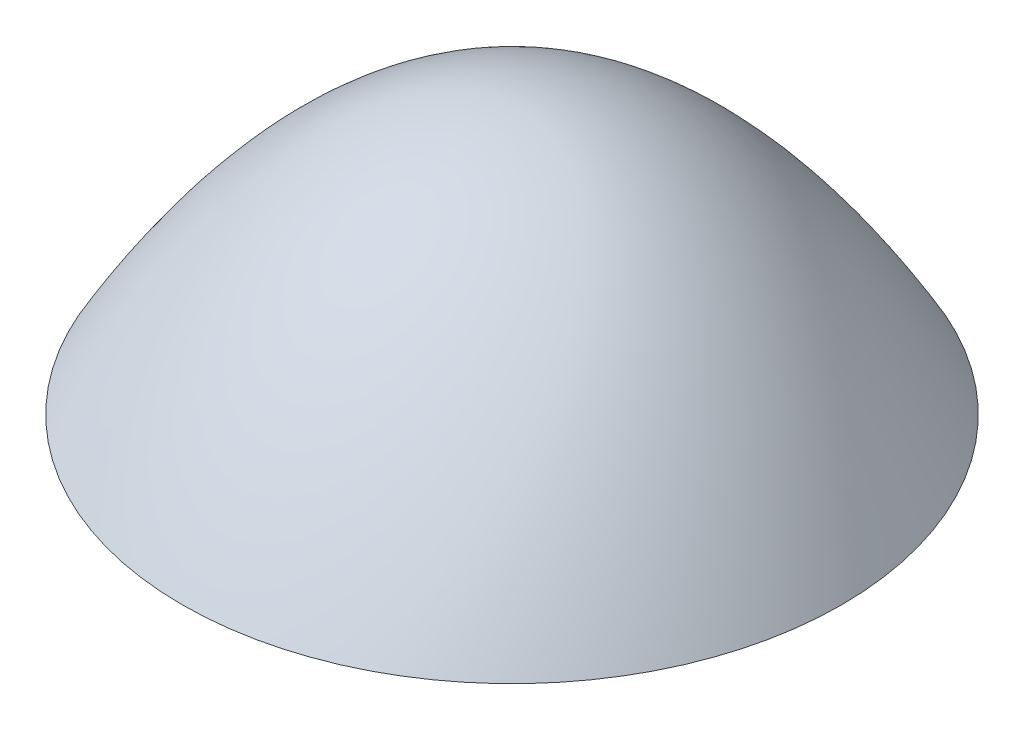
ISO-10303-21;
HEADER;
FILE_DESCRIPTION(('STEP AP214'),'2;1');
FILE_NAME('part.step','',(''),(''),'','','');
FILE_SCHEMA(('AUTOMOTIVE_DESIGN { 1 0 10303 214 1 1 1 1 }'));
ENDSEC;
DATA;
#1=APPLICATION_CONTEXT('core data for automotive mechanical design processes');
#2=APPLICATION_PROTOCOL_DEFINITION('international standard','automotive_design',2000,#1);
#3=PRODUCT_CONTEXT('',#1,'mechanical');
#4=PRODUCT('Part','Part','',(#3));
#5=PRODUCT_RELATED_PRODUCT_CATEGORY('part','',(#4));
#6=PRODUCT_DEFINITION_FORMATION('','',#4);
#7=PRODUCT_DEFINITION_CONTEXT('part definition',#1,'design');
#8=PRODUCT_DEFINITION('design','',#6,#7);
#9=PRODUCT_DEFINITION_SHAPE('','',#8);
#10=(LENGTH_UNIT() NAMED_UNIT(*) SI_UNIT(.MILLI.,.METRE.));
#11=(NAMED_UNIT(*) PLANE_ANGLE_UNIT() SI_UNIT($,.RADIAN.));
#12=(NAMED_UNIT(*) SI_UNIT($,.STERADIAN.) SOLID_ANGLE_UNIT());
#13=UNCERTAINTY_MEASURE_WITH_UNIT(LENGTH_MEASURE(1.E-05),#10,'distance_accuracy_value','');
#14=(GEOMETRIC_REPRESENTATION_CONTEXT(3) GLOBAL_UNCERTAINTY_ASSIGNED_CONTEXT((#13)) GLOBAL_UNIT_ASSIGNED_CONTEXT((#10,
#11,#12)) REPRESENTATION_CONTEXT('',''));
#15=CARTESIAN_POINT('',(0.,0.,0.));
#16=DIRECTION('',(0.,0.,1.));
#17=DIRECTION('',(1.,0.,0.));
#18=AXIS2_PLACEMENT_3D('',#15,#16,#17);
#19=CARTESIAN_POINT('',(0.,150.,0.));
#20=DIRECTION('',(0.,0.,-1.));
#21=DIRECTION('',(0.,1.,0.));
#22=AXIS2_PLACEMENT_3D('',#19,#20,#21);
#23=ELLIPSE('',#22,248.04,76.2);
#24=TRIMMED_CURVE('',#23,(PARAMETER_VALUE(0.)),(PARAMETER_VALUE(3.14159265358979)),.T.,.PARAMETER.);
#25=CARTESIAN_POINT('',(0.,0.,0.));
#26=DIRECTION('',(0.,-1.,0.));
#27=AXIS1_PLACEMENT('',#25,#26);
#28=SURFACE_OF_REVOLUTION('',#24,#27);
#29=CARTESIAN_POINT('',(0.,398.04,0.));
#30=VERTEX_POINT('',#29);
#31=VERTEX_LOOP('',#30);
#32=FACE_BOUND('',#31,.T.);
#33=CARTESIAN_POINT('',(0.,370.,0.));
#34=DIRECTION('',(0.,-1.,0.));
#35=DIRECTION('',(0.,0.,-1.));
#36=AXIS2_PLACEMENT_3D('',#33,#34,#35);
#37=CIRCLE('',#36,35.1936036452897);
#38=CARTESIAN_POINT('',(0.,370.,-35.1936036452897));
#39=VERTEX_POINT('',#38);
#40=EDGE_CURVE('E40',#39,#39,#37,.T.);
#41=ORIENTED_EDGE('',*,*,#40,.T.);
#42=EDGE_LOOP('',(#41));
#43=FACE_BOUND('',#42,.T.);
#44=ADVANCED_FACE('F35',(#32,#43),#28,.F.);
#45=CARTESIAN_POINT('',(0.,370.,0.));
#46=DIRECTION('',(0.,-1.,0.));
#47=DIRECTION('',(0.,0.,-1.));
#48=AXIS2_PLACEMENT_3D('',#45,#46,#47);
#49=PLANE('',#48);
#50=CARTESIAN_POINT('',(0.,370.,0.));
#51=DIRECTION('',(0.,-1.,0.));
#52=DIRECTION('',(0.,0.,-1.));
#53=AXIS2_PLACEMENT_3D('',#50,#51,#52);
#54=CIRCLE('',#53,37.4634477047783);
#55=CARTESIAN_POINT('',(0.,370.,-37.4634477047783));
#56=VERTEX_POINT('',#55);
#57=EDGE_CURVE('E11',#56,#56,#54,.F.);
#58=ORIENTED_EDGE('',*,*,#57,.F.);
#59=EDGE_LOOP('',(#58));
#60=FACE_BOUND('',#59,.T.);
#61=ORIENTED_EDGE('',*,*,#40,.F.);
#62=EDGE_LOOP('',(#61));
#63=FACE_BOUND('',#62,.T.);
#64=ADVANCED_FACE('F53',(#60,#63),#49,.T.);
#65=CARTESIAN_POINT('',(78.16,150.,0.));
#66=CARTESIAN_POINT('',(78.16,158.124741440831,0.));
#67=CARTESIAN_POINT('',(77.9143964283696,174.415956202879,0.));
#68=CARTESIAN_POINT('',(76.8126900292029,198.585734280331,0.));
#69=CARTESIAN_POINT('',(74.987978239891,222.299614595278,0.));
#70=CARTESIAN_POINT('',(71.6143857103054,252.993821618781,0.));
#71=CARTESIAN_POINT('',(65.6897649255414,289.080732547851,0.));
#72=CARTESIAN_POINT('',(56.1093429123413,327.087146411559,0.));
#73=CARTESIAN_POINT('',(44.4035725024656,358.368758891952,0.));
#74=CARTESIAN_POINT('',(33.2071437767828,377.875372885673,0.));
#75=CARTESIAN_POINT('',(23.5506825278786,389.130576689322,0.));
#76=CARTESIAN_POINT('',(15.9852093641942,395.313409978409,0.));
#77=CARTESIAN_POINT('',(8.09536320832362,399.131102802521,0.));
#78=CARTESIAN_POINT('',(2.72314978418837,400.,0.));
#79=CARTESIAN_POINT('',(0.,400.,0.));
#80=B_SPLINE_CURVE_WITH_KNOTS('',3,(#65,#66,#67,#68,#69,#70,#71,#72,#73,#74,#75,#76,#77,#78,
#79),.UNSPECIFIED.,.F.,.F.,(4,1,1,1,1,1,1,1,1,1,1,1,4),(-1.5707963267949,-1.47262155637022,
-1.37444678594553,-1.27627201552085,-1.17809724509617,-0.98174770424681,-0.785398163397448,
-0.589048622548086,-0.392699081698724,-0.294524311274043,-0.196349540849362,-0.0981747704246811,
0.),.UNSPECIFIED.);
#81=CARTESIAN_POINT('',(0.,0.,0.));
#82=DIRECTION('',(0.,-1.,0.));
#83=AXIS1_PLACEMENT('',#81,#82);
#84=SURFACE_OF_REVOLUTION('',#80,#83);
#85=CARTESIAN_POINT('',(0.,400.,0.));
#86=VERTEX_POINT('',#85);
#87=VERTEX_LOOP('',#86);
#88=FACE_BOUND('',#87,.T.);
#89=ORIENTED_EDGE('',*,*,#57,.T.);
#90=EDGE_LOOP('',(#89));
#91=FACE_BOUND('',#90,.T.);
#92=ADVANCED_FACE('F37',(#88,#91),#84,.F.);
#93=CLOSED_SHELL('',(#44,#64,#92));
#94=MANIFOLD_SOLID_BREP('B2',#93);
#95=ADVANCED_BREP_SHAPE_REPRESENTATION('',(#18,#94),#14);
#96=SHAPE_DEFINITION_REPRESENTATION(#9,#95);
ENDSEC;
END-ISO-10303-21;
